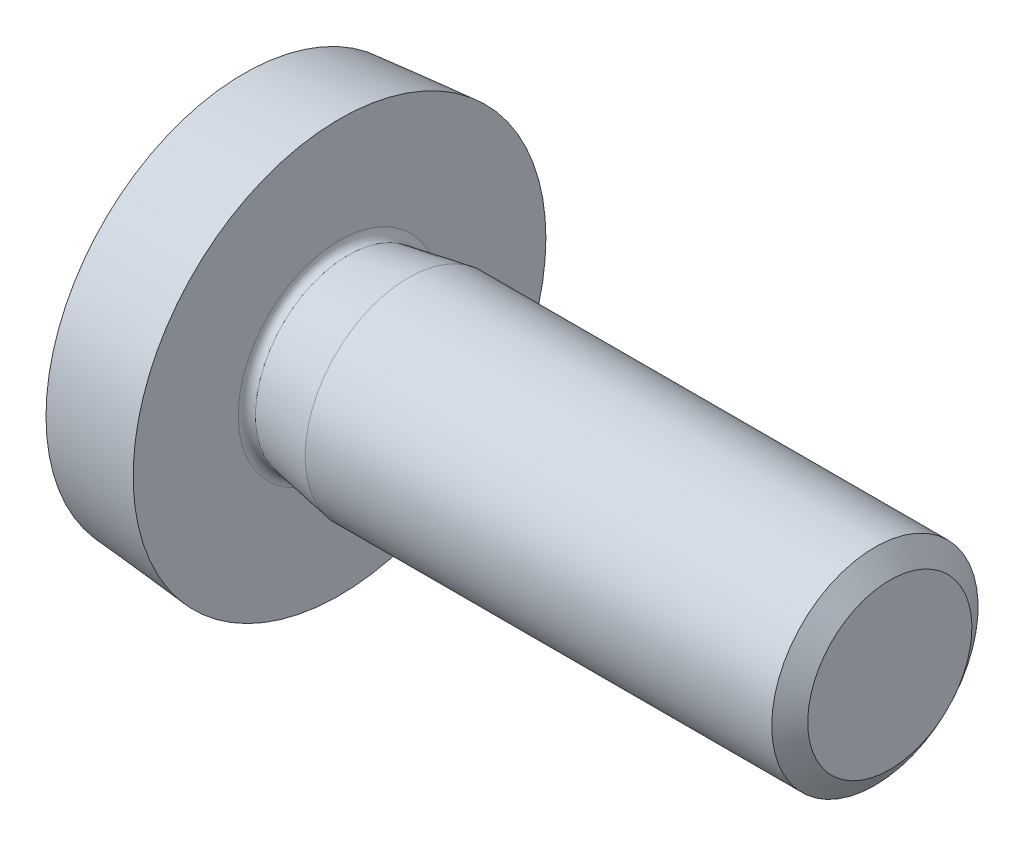
ISO-10303-21;
HEADER;
FILE_DESCRIPTION(('STEP AP214'),'2;1');
FILE_NAME('part.step','',(''),(''),'','','');
FILE_SCHEMA(('AUTOMOTIVE_DESIGN { 1 0 10303 214 1 1 1 1 }'));
ENDSEC;
DATA;
#1=APPLICATION_CONTEXT('core data for automotive mechanical design processes');
#2=APPLICATION_PROTOCOL_DEFINITION('international standard','automotive_design',2000,#1);
#3=PRODUCT_CONTEXT('',#1,'mechanical');
#4=PRODUCT('Part','Part','',(#3));
#5=PRODUCT_RELATED_PRODUCT_CATEGORY('part','',(#4));
#6=PRODUCT_DEFINITION_FORMATION('','',#4);
#7=PRODUCT_DEFINITION_CONTEXT('part definition',#1,'design');
#8=PRODUCT_DEFINITION('design','',#6,#7);
#9=PRODUCT_DEFINITION_SHAPE('','',#8);
#10=(LENGTH_UNIT() NAMED_UNIT(*) SI_UNIT(.MILLI.,.METRE.));
#11=(NAMED_UNIT(*) PLANE_ANGLE_UNIT() SI_UNIT($,.RADIAN.));
#12=(NAMED_UNIT(*) SI_UNIT($,.STERADIAN.) SOLID_ANGLE_UNIT());
#13=UNCERTAINTY_MEASURE_WITH_UNIT(LENGTH_MEASURE(1.E-05),#10,'distance_accuracy_value','');
#14=(GEOMETRIC_REPRESENTATION_CONTEXT(3) GLOBAL_UNCERTAINTY_ASSIGNED_CONTEXT((#13)) GLOBAL_UNIT_ASSIGNED_CONTEXT((#10,
#11,#12)) REPRESENTATION_CONTEXT('',''));
#15=CARTESIAN_POINT('',(0.,0.,0.));
#16=DIRECTION('',(0.,0.,1.));
#17=DIRECTION('',(1.,0.,0.));
#18=AXIS2_PLACEMENT_3D('',#15,#16,#17);
#19=CARTESIAN_POINT('',(-2.3,0.8625,3.45));
#20=DIRECTION('',(0.795355953719722,0.,0.606142645655782));
#21=DIRECTION('',(0.606142645655782,0.,-0.795355953719722));
#22=AXIS2_PLACEMENT_3D('',#19,#20,#21);
#23=PLANE('',#22);
#24=DIRECTION('',(0.,-1.,0.));
#25=VECTOR('',#24,1.);
#26=CARTESIAN_POINT('',(-2.3,0.8625,3.45));
#27=LINE('',#26,#25);
#28=CARTESIAN_POINT('',(-2.3,-0.8625,3.45));
#29=VERTEX_POINT('',#28);
#30=CARTESIAN_POINT('',(-2.3,0.8625,3.45));
#31=VERTEX_POINT('',#30);
#32=EDGE_CURVE('E139',#29,#31,#27,.F.);
#33=ORIENTED_EDGE('',*,*,#32,.T.);
#34=DIRECTION('',(0.606142645655782,0.,-0.795355953719722));
#35=VECTOR('',#34,1.);
#36=CARTESIAN_POINT('',(-2.3,0.8625,3.45));
#37=LINE('',#36,#35);
#38=CARTESIAN_POINT('',(-0.328060155582832,0.8625,0.8625));
#39=VERTEX_POINT('',#38);
#40=EDGE_CURVE('E141',#31,#39,#37,.T.);
#41=ORIENTED_EDGE('',*,*,#40,.T.);
#42=DIRECTION('',(0.,1.,0.));
#43=VECTOR('',#42,1.);
#44=CARTESIAN_POINT('',(-0.328060155582832,0.8625,0.8625));
#45=LINE('',#44,#43);
#46=CARTESIAN_POINT('',(-0.328060155582832,-0.8625,0.8625));
#47=VERTEX_POINT('',#46);
#48=EDGE_CURVE('E107',#47,#39,#45,.T.);
#49=ORIENTED_EDGE('',*,*,#48,.F.);
#50=DIRECTION('',(0.606142645655782,0.,-0.795355953719722));
#51=VECTOR('',#50,1.);
#52=CARTESIAN_POINT('',(-2.3,-0.8625,3.45));
#53=LINE('',#52,#51);
#54=EDGE_CURVE('E144',#29,#47,#53,.T.);
#55=ORIENTED_EDGE('',*,*,#54,.F.);
#56=EDGE_LOOP('',(#33,#41,#49,#55));
#57=FACE_BOUND('',#56,.T.);
#58=ADVANCED_FACE('F17',(#57),#23,.F.);
#59=CARTESIAN_POINT('',(-2.3,-3.45,0.8625));
#60=DIRECTION('',(0.792405815693061,-0.609994281330419,0.));
#61=DIRECTION('',(0.609994281330419,0.792405815693061,0.));
#62=AXIS2_PLACEMENT_3D('',#59,#60,#61);
#63=PLANE('',#62);
#64=DIRECTION('',(0.,0.,-1.));
#65=VECTOR('',#64,1.);
#66=CARTESIAN_POINT('',(-2.3,-3.45,0.8625));
#67=LINE('',#66,#65);
#68=CARTESIAN_POINT('',(-2.3,-3.45,-0.8625));
#69=VERTEX_POINT('',#68);
#70=CARTESIAN_POINT('',(-2.3,-3.45,0.8625));
#71=VERTEX_POINT('',#70);
#72=EDGE_CURVE('E130',#69,#71,#67,.F.);
#73=ORIENTED_EDGE('',*,*,#72,.T.);
#74=DIRECTION('',(0.609994281330419,0.792405815693061,0.));
#75=VECTOR('',#74,1.);
#76=CARTESIAN_POINT('',(-2.3,-3.45,0.8625));
#77=LINE('',#76,#75);
#78=CARTESIAN_POINT('',(-0.30814157129579,-0.8625,0.8625));
#79=VERTEX_POINT('',#78);
#80=EDGE_CURVE('E220',#71,#79,#77,.T.);
#81=ORIENTED_EDGE('',*,*,#80,.T.);
#82=DIRECTION('',(0.,0.,-1.));
#83=VECTOR('',#82,1.);
#84=CARTESIAN_POINT('',(-0.30814157129579,-0.8625,0.8625));
#85=LINE('',#84,#83);
#86=CARTESIAN_POINT('',(-0.30814157129579,-0.8625,-0.8625));
#87=VERTEX_POINT('',#86);
#88=EDGE_CURVE('E200',#79,#87,#85,.T.);
#89=ORIENTED_EDGE('',*,*,#88,.T.);
#90=DIRECTION('',(0.609994281330419,0.792405815693061,0.));
#91=VECTOR('',#90,1.);
#92=CARTESIAN_POINT('',(-2.3,-3.45,-0.8625));
#93=LINE('',#92,#91);
#94=EDGE_CURVE('E205',#69,#87,#93,.T.);
#95=ORIENTED_EDGE('',*,*,#94,.F.);
#96=EDGE_LOOP('',(#73,#81,#89,#95));
#97=FACE_BOUND('',#96,.T.);
#98=ADVANCED_FACE('F522',(#97),#63,.F.);
#99=CARTESIAN_POINT('',(-0.30814157129579,-0.8625,0.8625));
#100=DIRECTION('',(1.,0.,0.));
#101=DIRECTION('',(0.,0.,-1.));
#102=AXIS2_PLACEMENT_3D('',#99,#100,#101);
#103=PLANE('',#102);
#104=ORIENTED_EDGE('',*,*,#88,.F.);
#105=DIRECTION('',(0.,1.,0.));
#106=VECTOR('',#105,1.);
#107=CARTESIAN_POINT('',(-0.30814157129579,0.,0.8625));
#108=LINE('',#107,#106);
#109=CARTESIAN_POINT('',(-0.30814157129579,0.8625,0.8625));
#110=VERTEX_POINT('',#109);
#111=EDGE_CURVE('E222',#79,#110,#108,.T.);
#112=ORIENTED_EDGE('',*,*,#111,.T.);
#113=DIRECTION('',(0.,0.,1.));
#114=VECTOR('',#113,1.);
#115=CARTESIAN_POINT('',(-0.30814157129579,0.8625,0.8625));
#116=LINE('',#115,#114);
#117=CARTESIAN_POINT('',(-0.30814157129579,0.8625,-0.8625));
#118=VERTEX_POINT('',#117);
#119=EDGE_CURVE('E179',#110,#118,#116,.F.);
#120=ORIENTED_EDGE('',*,*,#119,.T.);
#121=DIRECTION('',(0.,1.,0.));
#122=VECTOR('',#121,1.);
#123=CARTESIAN_POINT('',(-0.30814157129579,0.,-0.8625));
#124=LINE('',#123,#122);
#125=EDGE_CURVE('E196',#87,#118,#124,.T.);
#126=ORIENTED_EDGE('',*,*,#125,.F.);
#127=EDGE_LOOP('',(#104,#112,#120,#126));
#128=FACE_BOUND('',#127,.T.);
#129=ADVANCED_FACE('F516',(#128),#103,.F.);
#130=CARTESIAN_POINT('',(-0.30814157129579,0.8625,0.8625));
#131=DIRECTION('',(0.792405815693061,0.609994281330419,0.));
#132=DIRECTION('',(-0.609994281330419,0.792405815693061,0.));
#133=AXIS2_PLACEMENT_3D('',#130,#131,#132);
#134=PLANE('',#133);
#135=ORIENTED_EDGE('',*,*,#119,.F.);
#136=DIRECTION('',(-0.609994281330419,0.792405815693061,0.));
#137=VECTOR('',#136,1.);
#138=CARTESIAN_POINT('',(-0.30814157129579,0.8625,0.8625));
#139=LINE('',#138,#137);
#140=CARTESIAN_POINT('',(-2.3,3.45,0.8625));
#141=VERTEX_POINT('',#140);
#142=EDGE_CURVE('E116',#110,#141,#139,.T.);
#143=ORIENTED_EDGE('',*,*,#142,.T.);
#144=DIRECTION('',(0.,0.,1.));
#145=VECTOR('',#144,1.);
#146=CARTESIAN_POINT('',(-2.3,3.45,0.8625));
#147=LINE('',#146,#145);
#148=CARTESIAN_POINT('',(-2.3,3.45,-0.8625));
#149=VERTEX_POINT('',#148);
#150=EDGE_CURVE('E155',#141,#149,#147,.F.);
#151=ORIENTED_EDGE('',*,*,#150,.T.);
#152=DIRECTION('',(-0.609994281330419,0.792405815693061,0.));
#153=VECTOR('',#152,1.);
#154=CARTESIAN_POINT('',(-0.30814157129579,0.8625,-0.8625));
#155=LINE('',#154,#153);
#156=EDGE_CURVE('E192',#118,#149,#155,.T.);
#157=ORIENTED_EDGE('',*,*,#156,.F.);
#158=EDGE_LOOP('',(#135,#143,#151,#157));
#159=FACE_BOUND('',#158,.T.);
#160=ADVANCED_FACE('F510',(#159),#134,.F.);
#161=CARTESIAN_POINT('',(-0.328060155582832,0.8625,-0.8625));
#162=DIRECTION('',(0.795355953719722,0.,-0.606142645655782));
#163=DIRECTION('',(-0.606142645655782,0.,-0.795355953719722));
#164=AXIS2_PLACEMENT_3D('',#161,#162,#163);
#165=PLANE('',#164);
#166=DIRECTION('',(0.,1.,0.));
#167=VECTOR('',#166,1.);
#168=CARTESIAN_POINT('',(-0.328060155582832,0.,-0.8625));
#169=LINE('',#168,#167);
#170=CARTESIAN_POINT('',(-0.328060155582832,0.8625,-0.8625));
#171=VERTEX_POINT('',#170);
#172=CARTESIAN_POINT('',(-0.328060155582832,-0.8625,-0.8625));
#173=VERTEX_POINT('',#172);
#174=EDGE_CURVE('E182',#171,#173,#169,.F.);
#175=ORIENTED_EDGE('',*,*,#174,.F.);
#176=DIRECTION('',(-0.606142645655782,0.,-0.795355953719722));
#177=VECTOR('',#176,1.);
#178=CARTESIAN_POINT('',(-0.328060155582832,0.8625,-0.8625));
#179=LINE('',#178,#177);
#180=CARTESIAN_POINT('',(-2.3,0.8625,-3.45));
#181=VERTEX_POINT('',#180);
#182=EDGE_CURVE('E122',#171,#181,#179,.T.);
#183=ORIENTED_EDGE('',*,*,#182,.T.);
#184=DIRECTION('',(0.,1.,0.));
#185=VECTOR('',#184,1.);
#186=CARTESIAN_POINT('',(-2.3,0.8625,-3.45));
#187=LINE('',#186,#185);
#188=CARTESIAN_POINT('',(-2.3,-0.8625,-3.45));
#189=VERTEX_POINT('',#188);
#190=EDGE_CURVE('E82',#189,#181,#187,.T.);
#191=ORIENTED_EDGE('',*,*,#190,.F.);
#192=DIRECTION('',(-0.606142645655782,0.,-0.795355953719722));
#193=VECTOR('',#192,1.);
#194=CARTESIAN_POINT('',(-0.328060155582832,-0.8625,-0.8625));
#195=LINE('',#194,#193);
#196=EDGE_CURVE('E169',#173,#189,#195,.T.);
#197=ORIENTED_EDGE('',*,*,#196,.F.);
#198=EDGE_LOOP('',(#175,#183,#191,#197));
#199=FACE_BOUND('',#198,.T.);
#200=ADVANCED_FACE('F363',(#199),#165,.F.);
#201=CARTESIAN_POINT('',(0.,0.8625,0.));
#202=DIRECTION('',(0.,1.,0.));
#203=DIRECTION('',(0.,0.,1.));
#204=AXIS2_PLACEMENT_3D('',#201,#202,#203);
#205=PLANE('',#204);
#206=CARTESIAN_POINT('',(-3.94631444741724,0.8625,-3.45));
#207=CARTESIAN_POINT('',(-3.97714311280233,0.8625,-3.36648366877087));
#208=CARTESIAN_POINT('',(-4.00685177974378,0.8625,-3.28255393845811));
#209=CARTESIAN_POINT('',(-4.06392789052948,0.8625,-3.11416785551597));
#210=CARTESIAN_POINT('',(-4.09130174348639,0.8625,-3.02971367527932));
#211=CARTESIAN_POINT('',(-4.14372647766967,0.8625,-2.8602842579847));
#212=CARTESIAN_POINT('',(-4.16878217733249,0.8625,-2.77531051182223));
#213=CARTESIAN_POINT('',(-4.21658436971985,0.8625,-2.60484612822877));
#214=CARTESIAN_POINT('',(-4.23933409137663,0.8625,-2.51935639625341));
#215=CARTESIAN_POINT('',(-4.2825331514834,0.8625,-2.34786265092894));
#216=CARTESIAN_POINT('',(-4.30298412198857,0.8625,-2.26185904868999));
#217=CARTESIAN_POINT('',(-4.34158990384638,0.8625,-2.08933802267162));
#218=CARTESIAN_POINT('',(-4.35974471519902,0.8625,-2.00282059889219));
#219=CARTESIAN_POINT('',(-4.39375746481333,0.8625,-1.82927119283388));
#220=CARTESIAN_POINT('',(-4.40961375145777,0.8625,-1.74223888686346));
#221=CARTESIAN_POINT('',(-4.43902366766466,0.8625,-1.56765878347351));
#222=CARTESIAN_POINT('',(-4.45257399034026,0.862499999999999,-1.48011042896091));
#223=CARTESIAN_POINT('',(-4.477361126086,0.862500000000001,-1.30449642581622));
#224=CARTESIAN_POINT('',(-4.48859294484434,0.862500000000005,-1.21643007223819));
#225=CARTESIAN_POINT('',(-4.50872764889703,0.862499999999995,-1.03977744971667));
#226=CARTESIAN_POINT('',(-4.5176238104541,0.862499999999983,-0.951190414370852));
#227=CARTESIAN_POINT('',(-4.52533059902794,0.862499999999952,-0.862499999999976));
#228=B_SPLINE_CURVE_WITH_KNOTS('',3,(#206,#207,#208,#209,#210,#211,#212,#213,#214,#215,#216,
#217,#218,#219,#220,#221,#222,#223,#224,#225,#226,#227),.UNSPECIFIED.,.F.,.F.,(4,2,2,2,2,2,2,2,
2,2,4),(0.,0.267065833244692,0.53337324165222,0.799114055080569,1.0644774713512,1.3296512801548,
1.5948250889584,1.86018850522903,2.12592931865738,2.39223672706491,2.6593025603096),.UNSPECIFIED.);
#229=CARTESIAN_POINT('',(-3.94631444741724,0.8625,-3.45));
#230=VERTEX_POINT('',#229);
#231=CARTESIAN_POINT('',(-4.52533059902793,0.862499999999999,-0.862500000000001));
#232=VERTEX_POINT('',#231);
#233=EDGE_CURVE('E73',#230,#232,#228,.T.);
#234=ORIENTED_EDGE('',*,*,#233,.F.);
#235=DIRECTION('',(-1.,0.,0.));
#236=VECTOR('',#235,1.);
#237=CARTESIAN_POINT('',(-2.3,0.8625,-3.45));
#238=LINE('',#237,#236);
#239=EDGE_CURVE('E171',#230,#181,#238,.F.);
#240=ORIENTED_EDGE('',*,*,#239,.T.);
#241=ORIENTED_EDGE('',*,*,#182,.F.);
#242=DIRECTION('',(1.,0.,0.));
#243=VECTOR('',#242,1.);
#244=CARTESIAN_POINT('',(0.,0.8625,-0.8625));
#245=LINE('',#244,#243);
#246=EDGE_CURVE('E186',#232,#171,#245,.T.);
#247=ORIENTED_EDGE('',*,*,#246,.F.);
#248=EDGE_LOOP('',(#234,#240,#241,#247));
#249=FACE_BOUND('',#248,.T.);
#250=ADVANCED_FACE('F357',(#249),#205,.F.);
#251=CARTESIAN_POINT('',(-2.3,3.45,0.8625));
#252=DIRECTION('',(0.,1.,0.));
#253=DIRECTION('',(0.,0.,1.));
#254=AXIS2_PLACEMENT_3D('',#251,#252,#253);
#255=PLANE('',#254);
#256=DIRECTION('',(1.,0.,0.));
#257=VECTOR('',#256,1.);
#258=CARTESIAN_POINT('',(0.,3.45,-0.8625));
#259=LINE('',#258,#257);
#260=CARTESIAN_POINT('',(-3.94631444741724,3.45,-0.8625));
#261=VERTEX_POINT('',#260);
#262=EDGE_CURVE('E195',#149,#261,#259,.F.);
#263=ORIENTED_EDGE('',*,*,#262,.F.);
#264=ORIENTED_EDGE('',*,*,#150,.F.);
#265=DIRECTION('',(1.,0.,0.));
#266=VECTOR('',#265,1.);
#267=CARTESIAN_POINT('',(0.,3.45,0.8625));
#268=LINE('',#267,#266);
#269=CARTESIAN_POINT('',(-3.94631444741724,3.45,0.8625));
#270=VERTEX_POINT('',#269);
#271=EDGE_CURVE('E231',#141,#270,#268,.F.);
#272=ORIENTED_EDGE('',*,*,#271,.T.);
#273=CARTESIAN_POINT('',(-3.94631444741724,3.45,-0.862499999999999));
#274=CARTESIAN_POINT('',(-3.95294091135976,3.45,-0.790695326163588));
#275=CARTESIAN_POINT('',(-3.95873958698046,3.45,-0.718814271789546));
#276=CARTESIAN_POINT('',(-3.96867110087433,3.45,-0.57505161932912));
#277=CARTESIAN_POINT('',(-3.97280656416535,3.45,-0.50317020257961));
#278=CARTESIAN_POINT('',(-3.97941890948352,3.45,-0.359407208954427));
#279=CARTESIAN_POINT('',(-3.98189753871711,3.45,-0.28752571243822));
#280=CARTESIAN_POINT('',(-3.98520107089638,3.45,-0.14376279721681));
#281=CARTESIAN_POINT('',(-3.98602684846002,3.45,-0.0718813986084052));
#282=CARTESIAN_POINT('',(-3.98602684846002,3.45,0.0718813986084039));
#283=CARTESIAN_POINT('',(-3.98520107089638,3.45,0.143762797216808));
#284=CARTESIAN_POINT('',(-3.98189753871711,3.45,0.287525712438218));
#285=CARTESIAN_POINT('',(-3.97941890948352,3.45,0.359407208954426));
#286=CARTESIAN_POINT('',(-3.97280656416535,3.45,0.503170202579609));
#287=CARTESIAN_POINT('',(-3.96867110087433,3.45,0.575051619329119));
#288=CARTESIAN_POINT('',(-3.95873958698046,3.45,0.718814271789545));
#289=CARTESIAN_POINT('',(-3.95294091135976,3.45,0.790695326163587));
#290=CARTESIAN_POINT('',(-3.94631444741724,3.45,0.862499999999998));
#291=B_SPLINE_CURVE_WITH_KNOTS('',3,(#273,#274,#275,#276,#277,#278,#279,#280,#281,#282,#283,
#284,#285,#286,#287,#288,#289,#290),.UNSPECIFIED.,.F.,.F.,(4,2,2,2,2,2,2,2,4),(0.,
0.216324549400109,0.432306325072924,0.64805997735649,0.863699431879933,1.07933888640338,
1.29509253868694,1.51107431435976,1.72739886375987),.UNSPECIFIED.);
#292=EDGE_CURVE('E327',#261,#270,#291,.T.);
#293=ORIENTED_EDGE('',*,*,#292,.F.);
#294=EDGE_LOOP('',(#263,#264,#272,#293));
#295=FACE_BOUND('',#294,.T.);
#296=ADVANCED_FACE('F325',(#295),#255,.F.);
#297=CARTESIAN_POINT('',(0.,0.8625,0.));
#298=DIRECTION('',(0.,1.,0.));
#299=DIRECTION('',(0.,0.,1.));
#300=AXIS2_PLACEMENT_3D('',#297,#298,#299);
#301=PLANE('',#300);
#302=ORIENTED_EDGE('',*,*,#40,.F.);
#303=DIRECTION('',(1.,0.,0.));
#304=VECTOR('',#303,1.);
#305=CARTESIAN_POINT('',(-4.83,0.8625,3.45));
#306=LINE('',#305,#304);
#307=CARTESIAN_POINT('',(-3.94631444741724,0.862500000000001,3.45));
#308=VERTEX_POINT('',#307);
#309=EDGE_CURVE('E148',#31,#308,#306,.F.);
#310=ORIENTED_EDGE('',*,*,#309,.T.);
#311=CARTESIAN_POINT('',(-4.52533059902793,0.8625,0.8625));
#312=CARTESIAN_POINT('',(-4.5176238104541,0.8625,0.951190414370874));
#313=CARTESIAN_POINT('',(-4.50872764889702,0.8625,1.03977744971669));
#314=CARTESIAN_POINT('',(-4.48859294484434,0.8625,1.21643007223821));
#315=CARTESIAN_POINT('',(-4.477361126086,0.8625,1.30449642581623));
#316=CARTESIAN_POINT('',(-4.45257399034026,0.8625,1.48011042896092));
#317=CARTESIAN_POINT('',(-4.43902366766466,0.8625,1.56765878347352));
#318=CARTESIAN_POINT('',(-4.40961375145777,0.8625,1.74223888686345));
#319=CARTESIAN_POINT('',(-4.39375746481333,0.8625,1.82927119283387));
#320=CARTESIAN_POINT('',(-4.35974471519902,0.8625,2.00282059889218));
#321=CARTESIAN_POINT('',(-4.34158990384638,0.8625,2.08933802267161));
#322=CARTESIAN_POINT('',(-4.30298412198857,0.8625,2.26185904868998));
#323=CARTESIAN_POINT('',(-4.2825331514834,0.8625,2.34786265092892));
#324=CARTESIAN_POINT('',(-4.23933409137664,0.8625,2.51935639625338));
#325=CARTESIAN_POINT('',(-4.21658436971986,0.8625,2.60484612822874));
#326=CARTESIAN_POINT('',(-4.1687821773325,0.8625,2.7753105118222));
#327=CARTESIAN_POINT('',(-4.14372647766969,0.8625,2.86028425798467));
#328=CARTESIAN_POINT('',(-4.0913017434864,0.8625,3.02971367527928));
#329=CARTESIAN_POINT('',(-4.0639278905295,0.8625,3.11416785551593));
#330=CARTESIAN_POINT('',(-4.0068517797438,0.8625,3.28255393845807));
#331=CARTESIAN_POINT('',(-3.97714311280234,0.8625,3.36648366877082));
#332=CARTESIAN_POINT('',(-3.94631444741726,0.8625,3.44999999999995));
#333=B_SPLINE_CURVE_WITH_KNOTS('',3,(#311,#312,#313,#314,#315,#316,#317,#318,#319,#320,#321,
#322,#323,#324,#325,#326,#327,#328,#329,#330,#331,#332),.UNSPECIFIED.,.F.,.F.,(4,2,2,2,2,2,2,2,
2,2,4),(0.,0.267065833244684,0.533373241652204,0.799114055080544,1.06447747135116,
1.32965128015476,1.59482508895836,1.86018850522897,2.12592931865731,2.39223672706484,
2.65930256030952),.UNSPECIFIED.);
#334=CARTESIAN_POINT('',(-4.52533059902793,0.8625,0.8625));
#335=VERTEX_POINT('',#334);
#336=EDGE_CURVE('E333',#335,#308,#333,.T.);
#337=ORIENTED_EDGE('',*,*,#336,.F.);
#338=DIRECTION('',(1.,0.,0.));
#339=VECTOR('',#338,1.);
#340=CARTESIAN_POINT('',(0.,0.8625,0.8625));
#341=LINE('',#340,#339);
#342=EDGE_CURVE('E154',#335,#39,#341,.T.);
#343=ORIENTED_EDGE('',*,*,#342,.T.);
#344=EDGE_LOOP('',(#302,#310,#337,#343));
#345=FACE_BOUND('',#344,.T.);
#346=ADVANCED_FACE('F151',(#345),#301,.F.);
#347=CARTESIAN_POINT('',(-4.83,0.8625,3.45));
#348=DIRECTION('',(0.,0.,1.));
#349=DIRECTION('',(0.,-1.,0.));
#350=AXIS2_PLACEMENT_3D('',#347,#348,#349);
#351=PLANE('',#350);
#352=ORIENTED_EDGE('',*,*,#309,.F.);
#353=ORIENTED_EDGE('',*,*,#32,.F.);
#354=DIRECTION('',(1.,0.,0.));
#355=VECTOR('',#354,1.);
#356=CARTESIAN_POINT('',(0.,-0.8625,3.45));
#357=LINE('',#356,#355);
#358=CARTESIAN_POINT('',(-3.94631444741724,-0.862499999999999,3.45));
#359=VERTEX_POINT('',#358);
#360=EDGE_CURVE('E161',#359,#29,#357,.T.);
#361=ORIENTED_EDGE('',*,*,#360,.F.);
#362=CARTESIAN_POINT('',(-3.94631444741724,0.862500000000002,3.45));
#363=CARTESIAN_POINT('',(-3.95294091135976,0.790695326163591,3.45));
#364=CARTESIAN_POINT('',(-3.95873958698046,0.718814271789549,3.45));
#365=CARTESIAN_POINT('',(-3.96867110087433,0.575051619329122,3.45));
#366=CARTESIAN_POINT('',(-3.97280656416535,0.503170202579612,3.45));
#367=CARTESIAN_POINT('',(-3.97941890948352,0.359407208954429,3.45));
#368=CARTESIAN_POINT('',(-3.98189753871711,0.287525712438222,3.45));
#369=CARTESIAN_POINT('',(-3.98520107089638,0.143762797216812,3.45));
#370=CARTESIAN_POINT('',(-3.98602684846002,0.0718813986084069,3.45));
#371=CARTESIAN_POINT('',(-3.98602684846002,-0.0718813986084025,3.45));
#372=CARTESIAN_POINT('',(-3.98520107089638,-0.143762797216807,3.45));
#373=CARTESIAN_POINT('',(-3.98189753871711,-0.287525712438217,3.45));
#374=CARTESIAN_POINT('',(-3.97941890948352,-0.359407208954425,3.45));
#375=CARTESIAN_POINT('',(-3.97280656416535,-0.503170202579608,3.45));
#376=CARTESIAN_POINT('',(-3.96867110087433,-0.575051619329118,3.45));
#377=CARTESIAN_POINT('',(-3.95873958698046,-0.718814271789545,3.45));
#378=CARTESIAN_POINT('',(-3.95294091135976,-0.790695326163587,3.45));
#379=CARTESIAN_POINT('',(-3.94631444741724,-0.862499999999998,3.45));
#380=B_SPLINE_CURVE_WITH_KNOTS('',3,(#362,#363,#364,#365,#366,#367,#368,#369,#370,#371,#372,
#373,#374,#375,#376,#377,#378,#379),.UNSPECIFIED.,.F.,.F.,(4,2,2,2,2,2,2,2,4),(0.,
0.21632454940011,0.432306325072925,0.648059977356491,0.863699431879935,1.07933888640338,
1.29509253868694,1.51107431435976,1.72739886375987),.UNSPECIFIED.);
#381=EDGE_CURVE('E159',#308,#359,#380,.T.);
#382=ORIENTED_EDGE('',*,*,#381,.F.);
#383=EDGE_LOOP('',(#352,#353,#361,#382));
#384=FACE_BOUND('',#383,.T.);
#385=ADVANCED_FACE('F157',(#384),#351,.F.);
#386=CARTESIAN_POINT('',(0.,-0.8625,0.));
#387=DIRECTION('',(0.,1.,0.));
#388=DIRECTION('',(0.,0.,1.));
#389=AXIS2_PLACEMENT_3D('',#386,#387,#388);
#390=PLANE('',#389);
#391=ORIENTED_EDGE('',*,*,#360,.T.);
#392=ORIENTED_EDGE('',*,*,#54,.T.);
#393=DIRECTION('',(1.,0.,0.));
#394=VECTOR('',#393,1.);
#395=CARTESIAN_POINT('',(0.,-0.8625,0.8625));
#396=LINE('',#395,#394);
#397=CARTESIAN_POINT('',(-4.52533059902793,-0.862499999999999,0.8625));
#398=VERTEX_POINT('',#397);
#399=EDGE_CURVE('E217',#47,#398,#396,.F.);
#400=ORIENTED_EDGE('',*,*,#399,.T.);
#401=CARTESIAN_POINT('',(-3.94631444741724,-0.862499999999998,3.45));
#402=CARTESIAN_POINT('',(-3.97714311280233,-0.862499999999999,3.36648366877087));
#403=CARTESIAN_POINT('',(-4.00685177974378,-0.8625,3.28255393845811));
#404=CARTESIAN_POINT('',(-4.06392789052948,-0.8625,3.11416785551597));
#405=CARTESIAN_POINT('',(-4.09130174348639,-0.8625,3.02971367527932));
#406=CARTESIAN_POINT('',(-4.14372647766967,-0.8625,2.86028425798471));
#407=CARTESIAN_POINT('',(-4.16878217733249,-0.8625,2.77531051182224));
#408=CARTESIAN_POINT('',(-4.21658436971985,-0.8625,2.60484612822877));
#409=CARTESIAN_POINT('',(-4.23933409137663,-0.8625,2.51935639625341));
#410=CARTESIAN_POINT('',(-4.2825331514834,-0.8625,2.34786265092895));
#411=CARTESIAN_POINT('',(-4.30298412198857,-0.8625,2.26185904869001));
#412=CARTESIAN_POINT('',(-4.34158990384638,-0.8625,2.08933802267163));
#413=CARTESIAN_POINT('',(-4.35974471519902,-0.8625,2.00282059889221));
#414=CARTESIAN_POINT('',(-4.39375746481333,-0.8625,1.82927119283389));
#415=CARTESIAN_POINT('',(-4.40961375145777,-0.8625,1.74223888686347));
#416=CARTESIAN_POINT('',(-4.43902366766465,-0.8625,1.56765878347353));
#417=CARTESIAN_POINT('',(-4.45257399034026,-0.8625,1.48011042896093));
#418=CARTESIAN_POINT('',(-4.477361126086,-0.8625,1.30449642581624));
#419=CARTESIAN_POINT('',(-4.48859294484434,-0.8625,1.21643007223821));
#420=CARTESIAN_POINT('',(-4.50872764889702,-0.8625,1.03977744971669));
#421=CARTESIAN_POINT('',(-4.5176238104541,-0.8625,0.951190414370876));
#422=CARTESIAN_POINT('',(-4.52533059902793,-0.862500000000001,0.8625));
#423=B_SPLINE_CURVE_WITH_KNOTS('',3,(#401,#402,#403,#404,#405,#406,#407,#408,#409,#410,#411,
#412,#413,#414,#415,#416,#417,#418,#419,#420,#421,#422),.UNSPECIFIED.,.F.,.F.,(4,2,2,2,2,2,2,2,
2,2,4),(0.,0.267065833244689,0.533373241652215,0.799114055080561,1.06447747135119,
1.32965128015479,1.59482508895839,1.86018850522901,2.12592931865736,2.39223672706489,
2.65930256030957),.UNSPECIFIED.);
#424=EDGE_CURVE('E641',#359,#398,#423,.T.);
#425=ORIENTED_EDGE('',*,*,#424,.F.);
#426=EDGE_LOOP('',(#391,#392,#400,#425));
#427=FACE_BOUND('',#426,.T.);
#428=ADVANCED_FACE('F479',(#427),#390,.T.);
#429=CARTESIAN_POINT('',(0.,0.,0.8625));
#430=DIRECTION('',(0.,0.,1.));
#431=DIRECTION('',(1.,0.,0.));
#432=AXIS2_PLACEMENT_3D('',#429,#430,#431);
#433=PLANE('',#432);
#434=ORIENTED_EDGE('',*,*,#48,.T.);
#435=ORIENTED_EDGE('',*,*,#342,.F.);
#436=CARTESIAN_POINT('',(-3.94631444741724,3.45,0.8625));
#437=CARTESIAN_POINT('',(-3.97714311280233,3.36648366877087,0.8625));
#438=CARTESIAN_POINT('',(-4.00685177974378,3.28255393845811,0.8625));
#439=CARTESIAN_POINT('',(-4.06392789052948,3.11416785551597,0.8625));
#440=CARTESIAN_POINT('',(-4.09130174348639,3.02971367527932,0.8625));
#441=CARTESIAN_POINT('',(-4.14372647766967,2.86028425798471,0.8625));
#442=CARTESIAN_POINT('',(-4.16878217733249,2.77531051182224,0.8625));
#443=CARTESIAN_POINT('',(-4.21658436971985,2.60484612822877,0.8625));
#444=CARTESIAN_POINT('',(-4.23933409137663,2.51935639625341,0.8625));
#445=CARTESIAN_POINT('',(-4.2825331514834,2.34786265092895,0.8625));
#446=CARTESIAN_POINT('',(-4.30298412198857,2.26185904869,0.8625));
#447=CARTESIAN_POINT('',(-4.34158990384638,2.08933802267163,0.8625));
#448=CARTESIAN_POINT('',(-4.35974471519902,2.00282059889221,0.8625));
#449=CARTESIAN_POINT('',(-4.39375746481333,1.82927119283389,0.8625));
#450=CARTESIAN_POINT('',(-4.40961375145777,1.74223888686347,0.8625));
#451=CARTESIAN_POINT('',(-4.43902366766465,1.56765878347353,0.8625));
#452=CARTESIAN_POINT('',(-4.45257399034026,1.48011042896093,0.8625));
#453=CARTESIAN_POINT('',(-4.477361126086,1.30449642581624,0.8625));
#454=CARTESIAN_POINT('',(-4.48859294484434,1.21643007223821,0.8625));
#455=CARTESIAN_POINT('',(-4.50872764889702,1.03977744971669,0.8625));
#456=CARTESIAN_POINT('',(-4.51762381045409,0.951190414370876,0.8625));
#457=CARTESIAN_POINT('',(-4.52533059902793,0.8625,0.8625));
#458=B_SPLINE_CURVE_WITH_KNOTS('',3,(#436,#437,#438,#439,#440,#441,#442,#443,#444,#445,#446,
#447,#448,#449,#450,#451,#452,#453,#454,#455,#456,#457),.UNSPECIFIED.,.F.,.F.,(4,2,2,2,2,2,2,2,
2,2,4),(0.,0.267065833244688,0.533373241652214,0.799114055080561,1.06447747135119,
1.32965128015479,1.59482508895839,1.86018850522901,2.12592931865736,2.39223672706489,
2.65930256030957),.UNSPECIFIED.);
#459=EDGE_CURVE('E330',#270,#335,#458,.T.);
#460=ORIENTED_EDGE('',*,*,#459,.F.);
#461=ORIENTED_EDGE('',*,*,#271,.F.);
#462=ORIENTED_EDGE('',*,*,#142,.F.);
#463=ORIENTED_EDGE('',*,*,#111,.F.);
#464=ORIENTED_EDGE('',*,*,#80,.F.);
#465=DIRECTION('',(1.,0.,0.));
#466=VECTOR('',#465,1.);
#467=CARTESIAN_POINT('',(-5.06,-3.45,0.8625));
#468=LINE('',#467,#466);
#469=CARTESIAN_POINT('',(-3.94631444741724,-3.45,0.8625));
#470=VERTEX_POINT('',#469);
#471=EDGE_CURVE('E216',#71,#470,#468,.F.);
#472=ORIENTED_EDGE('',*,*,#471,.T.);
#473=CARTESIAN_POINT('',(-4.52533059902793,-0.862499999999999,0.8625));
#474=CARTESIAN_POINT('',(-4.51762381045409,-0.951190414370874,0.8625));
#475=CARTESIAN_POINT('',(-4.50872764889702,-1.03977744971669,0.8625));
#476=CARTESIAN_POINT('',(-4.48859294484434,-1.21643007223821,0.8625));
#477=CARTESIAN_POINT('',(-4.477361126086,-1.30449642581624,0.8625));
#478=CARTESIAN_POINT('',(-4.45257399034026,-1.48011042896093,0.8625));
#479=CARTESIAN_POINT('',(-4.43902366766465,-1.56765878347353,0.8625));
#480=CARTESIAN_POINT('',(-4.40961375145777,-1.74223888686347,0.8625));
#481=CARTESIAN_POINT('',(-4.39375746481333,-1.82927119283389,0.8625));
#482=CARTESIAN_POINT('',(-4.35974471519902,-2.0028205988922,0.8625));
#483=CARTESIAN_POINT('',(-4.34158990384638,-2.08933802267163,0.8625));
#484=CARTESIAN_POINT('',(-4.30298412198857,-2.26185904869,0.8625));
#485=CARTESIAN_POINT('',(-4.2825331514834,-2.34786265092895,0.8625));
#486=CARTESIAN_POINT('',(-4.23933409137663,-2.51935639625341,0.8625));
#487=CARTESIAN_POINT('',(-4.21658436971985,-2.60484612822877,0.8625));
#488=CARTESIAN_POINT('',(-4.16878217733249,-2.77531051182224,0.8625));
#489=CARTESIAN_POINT('',(-4.14372647766968,-2.8602842579847,0.8625));
#490=CARTESIAN_POINT('',(-4.09130174348639,-3.02971367527932,0.8625));
#491=CARTESIAN_POINT('',(-4.06392789052948,-3.11416785551597,0.862500000000001));
#492=CARTESIAN_POINT('',(-4.00685177974379,-3.28255393845811,0.8625));
#493=CARTESIAN_POINT('',(-3.97714311280233,-3.36648366877087,0.862499999999998));
#494=CARTESIAN_POINT('',(-3.94631444741724,-3.45,0.862499999999995));
#495=B_SPLINE_CURVE_WITH_KNOTS('',3,(#473,#474,#475,#476,#477,#478,#479,#480,#481,#482,#483,
#484,#485,#486,#487,#488,#489,#490,#491,#492,#493,#494),.UNSPECIFIED.,.F.,.F.,(4,2,2,2,2,2,2,2,
2,2,4),(0.,0.267065833244688,0.533373241652214,0.79911405508056,1.06447747135118,
1.32965128015479,1.59482508895839,1.86018850522901,2.12592931865736,2.39223672706488,
2.65930256030957),.UNSPECIFIED.);
#496=EDGE_CURVE('E637',#398,#470,#495,.T.);
#497=ORIENTED_EDGE('',*,*,#496,.F.);
#498=ORIENTED_EDGE('',*,*,#399,.F.);
#499=EDGE_LOOP('',(#434,#435,#460,#461,#462,#463,#464,#472,#497,#498));
#500=FACE_BOUND('',#499,.T.);
#501=ADVANCED_FACE('F331',(#500),#433,.F.);
#502=CARTESIAN_POINT('',(-5.06,-3.45,0.8625));
#503=DIRECTION('',(0.,-1.,0.));
#504=DIRECTION('',(0.,0.,-1.));
#505=AXIS2_PLACEMENT_3D('',#502,#503,#504);
#506=PLANE('',#505);
#507=ORIENTED_EDGE('',*,*,#471,.F.);
#508=ORIENTED_EDGE('',*,*,#72,.F.);
#509=DIRECTION('',(1.,0.,0.));
#510=VECTOR('',#509,1.);
#511=CARTESIAN_POINT('',(0.,-3.45,-0.8625));
#512=LINE('',#511,#510);
#513=CARTESIAN_POINT('',(-3.94631444741724,-3.45,-0.8625));
#514=VERTEX_POINT('',#513);
#515=EDGE_CURVE('E185',#514,#69,#512,.T.);
#516=ORIENTED_EDGE('',*,*,#515,.F.);
#517=CARTESIAN_POINT('',(-3.94631444741724,-3.45,0.8625));
#518=CARTESIAN_POINT('',(-3.95294091135976,-3.45,0.790695326163589));
#519=CARTESIAN_POINT('',(-3.95873958698046,-3.45,0.718814271789547));
#520=CARTESIAN_POINT('',(-3.96867110087433,-3.45,0.57505161932912));
#521=CARTESIAN_POINT('',(-3.97280656416535,-3.45,0.50317020257961));
#522=CARTESIAN_POINT('',(-3.97941890948352,-3.45,0.359407208954427));
#523=CARTESIAN_POINT('',(-3.98189753871711,-3.45,0.287525712438219));
#524=CARTESIAN_POINT('',(-3.98520107089638,-3.45,0.143762797216809));
#525=CARTESIAN_POINT('',(-3.98602684846002,-3.45,0.0718813986084046));
#526=CARTESIAN_POINT('',(-3.98602684846002,-3.45,-0.0718813986084048));
#527=CARTESIAN_POINT('',(-3.98520107089638,-3.45,-0.143762797216809));
#528=CARTESIAN_POINT('',(-3.98189753871711,-3.45,-0.28752571243822));
#529=CARTESIAN_POINT('',(-3.97941890948352,-3.45,-0.359407208954427));
#530=CARTESIAN_POINT('',(-3.97280656416535,-3.45,-0.50317020257961));
#531=CARTESIAN_POINT('',(-3.96867110087433,-3.45,-0.57505161932912));
#532=CARTESIAN_POINT('',(-3.95873958698046,-3.45,-0.718814271789547));
#533=CARTESIAN_POINT('',(-3.95294091135976,-3.45,-0.790695326163589));
#534=CARTESIAN_POINT('',(-3.94631444741724,-3.45,-0.8625));
#535=B_SPLINE_CURVE_WITH_KNOTS('',3,(#517,#518,#519,#520,#521,#522,#523,#524,#525,#526,#527,
#528,#529,#530,#531,#532,#533,#534),.UNSPECIFIED.,.F.,.F.,(4,2,2,2,2,2,2,2,4),(0.,
0.21632454940011,0.432306325072925,0.648059977356491,0.863699431879935,1.07933888640338,
1.29509253868694,1.51107431435976,1.72739886375987),.UNSPECIFIED.);
#536=EDGE_CURVE('E632',#470,#514,#535,.T.);
#537=ORIENTED_EDGE('',*,*,#536,.F.);
#538=EDGE_LOOP('',(#507,#508,#516,#537));
#539=FACE_BOUND('',#538,.T.);
#540=ADVANCED_FACE('F465',(#539),#506,.F.);
#541=CARTESIAN_POINT('',(0.,0.,-0.8625));
#542=DIRECTION('',(0.,0.,1.));
#543=DIRECTION('',(1.,0.,0.));
#544=AXIS2_PLACEMENT_3D('',#541,#542,#543);
#545=PLANE('',#544);
#546=ORIENTED_EDGE('',*,*,#262,.T.);
#547=CARTESIAN_POINT('',(-4.52533059902793,0.862499999999998,-0.862500000000003));
#548=CARTESIAN_POINT('',(-4.5176238104541,0.951190414370874,-0.862500000000001));
#549=CARTESIAN_POINT('',(-4.50872764889702,1.03977744971669,-0.8625));
#550=CARTESIAN_POINT('',(-4.48859294484434,1.21643007223821,-0.8625));
#551=CARTESIAN_POINT('',(-4.477361126086,1.30449642581624,-0.8625));
#552=CARTESIAN_POINT('',(-4.45257399034026,1.48011042896093,-0.8625));
#553=CARTESIAN_POINT('',(-4.43902366766465,1.56765878347353,-0.8625));
#554=CARTESIAN_POINT('',(-4.40961375145777,1.74223888686347,-0.8625));
#555=CARTESIAN_POINT('',(-4.39375746481333,1.82927119283389,-0.8625));
#556=CARTESIAN_POINT('',(-4.35974471519902,2.0028205988922,-0.8625));
#557=CARTESIAN_POINT('',(-4.34158990384638,2.08933802267163,-0.8625));
#558=CARTESIAN_POINT('',(-4.30298412198857,2.26185904869,-0.8625));
#559=CARTESIAN_POINT('',(-4.2825331514834,2.34786265092895,-0.8625));
#560=CARTESIAN_POINT('',(-4.23933409137663,2.51935639625341,-0.8625));
#561=CARTESIAN_POINT('',(-4.21658436971985,2.60484612822877,-0.8625));
#562=CARTESIAN_POINT('',(-4.16878217733249,2.77531051182224,-0.8625));
#563=CARTESIAN_POINT('',(-4.14372647766967,2.8602842579847,-0.8625));
#564=CARTESIAN_POINT('',(-4.09130174348639,3.02971367527932,-0.8625));
#565=CARTESIAN_POINT('',(-4.06392789052948,3.11416785551597,-0.8625));
#566=CARTESIAN_POINT('',(-4.00685177974378,3.28255393845811,-0.8625));
#567=CARTESIAN_POINT('',(-3.97714311280233,3.36648366877087,-0.8625));
#568=CARTESIAN_POINT('',(-3.94631444741724,3.45,-0.862499999999999));
#569=B_SPLINE_CURVE_WITH_KNOTS('',3,(#547,#548,#549,#550,#551,#552,#553,#554,#555,#556,#557,
#558,#559,#560,#561,#562,#563,#564,#565,#566,#567,#568),.UNSPECIFIED.,.F.,.F.,(4,2,2,2,2,2,2,2,
2,2,4),(0.,0.267065833244689,0.533373241652215,0.799114055080561,1.06447747135119,
1.32965128015479,1.59482508895839,1.86018850522901,2.12592931865736,2.39223672706489,
2.65930256030957),.UNSPECIFIED.);
#570=EDGE_CURVE('E337',#232,#261,#569,.T.);
#571=ORIENTED_EDGE('',*,*,#570,.F.);
#572=ORIENTED_EDGE('',*,*,#246,.T.);
#573=ORIENTED_EDGE('',*,*,#174,.T.);
#574=DIRECTION('',(1.,0.,0.));
#575=VECTOR('',#574,1.);
#576=CARTESIAN_POINT('',(0.,-0.8625,-0.8625));
#577=LINE('',#576,#575);
#578=CARTESIAN_POINT('',(-4.52533059902793,-0.8625,-0.862500000000001));
#579=VERTEX_POINT('',#578);
#580=EDGE_CURVE('E172',#579,#173,#577,.T.);
#581=ORIENTED_EDGE('',*,*,#580,.F.);
#582=CARTESIAN_POINT('',(-3.94631444741724,-3.45,-0.8625));
#583=CARTESIAN_POINT('',(-3.97714311280233,-3.36648366877087,-0.8625));
#584=CARTESIAN_POINT('',(-4.00685177974378,-3.28255393845811,-0.8625));
#585=CARTESIAN_POINT('',(-4.06392789052948,-3.11416785551597,-0.8625));
#586=CARTESIAN_POINT('',(-4.09130174348639,-3.02971367527932,-0.8625));
#587=CARTESIAN_POINT('',(-4.14372647766967,-2.86028425798471,-0.8625));
#588=CARTESIAN_POINT('',(-4.16878217733249,-2.77531051182224,-0.8625));
#589=CARTESIAN_POINT('',(-4.21658436971985,-2.60484612822878,-0.8625));
#590=CARTESIAN_POINT('',(-4.23933409137663,-2.51935639625342,-0.8625));
#591=CARTESIAN_POINT('',(-4.28253315148339,-2.34786265092896,-0.8625));
#592=CARTESIAN_POINT('',(-4.30298412198856,-2.26185904869001,-0.8625));
#593=CARTESIAN_POINT('',(-4.34158990384638,-2.08933802267164,-0.8625));
#594=CARTESIAN_POINT('',(-4.35974471519902,-2.00282059889221,-0.8625));
#595=CARTESIAN_POINT('',(-4.39375746481333,-1.8292711928339,-0.8625));
#596=CARTESIAN_POINT('',(-4.40961375145777,-1.74223888686348,-0.8625));
#597=CARTESIAN_POINT('',(-4.43902366766465,-1.56765878347354,-0.8625));
#598=CARTESIAN_POINT('',(-4.45257399034026,-1.48011042896094,-0.8625));
#599=CARTESIAN_POINT('',(-4.477361126086,-1.30449642581625,-0.8625));
#600=CARTESIAN_POINT('',(-4.48859294484434,-1.21643007223822,-0.862499999999999));
#601=CARTESIAN_POINT('',(-4.50872764889702,-1.0397774497167,-0.862500000000001));
#602=CARTESIAN_POINT('',(-4.51762381045409,-0.951190414370888,-0.862500000000003));
#603=CARTESIAN_POINT('',(-4.52533059902793,-0.862500000000012,-0.862500000000008));
#604=B_SPLINE_CURVE_WITH_KNOTS('',3,(#582,#583,#584,#585,#586,#587,#588,#589,#590,#591,#592,
#593,#594,#595,#596,#597,#598,#599,#600,#601,#602,#603),.UNSPECIFIED.,.F.,.F.,(4,2,2,2,2,2,2,2,
2,2,4),(0.,0.267065833244687,0.533373241652212,0.799114055080556,1.06447747135118,
1.32965128015478,1.59482508895838,1.860188505229,2.12592931865735,2.39223672706487,
2.65930256030956),.UNSPECIFIED.);
#605=EDGE_CURVE('E636',#514,#579,#604,.T.);
#606=ORIENTED_EDGE('',*,*,#605,.F.);
#607=ORIENTED_EDGE('',*,*,#515,.T.);
#608=ORIENTED_EDGE('',*,*,#94,.T.);
#609=ORIENTED_EDGE('',*,*,#125,.T.);
#610=ORIENTED_EDGE('',*,*,#156,.T.);
#611=EDGE_LOOP('',(#546,#571,#572,#573,#581,#606,#607,#608,#609,#610));
#612=FACE_BOUND('',#611,.T.);
#613=ADVANCED_FACE('F459',(#612),#545,.T.);
#614=CARTESIAN_POINT('',(0.,-0.8625,0.));
#615=DIRECTION('',(0.,1.,0.));
#616=DIRECTION('',(0.,0.,1.));
#617=AXIS2_PLACEMENT_3D('',#614,#615,#616);
#618=PLANE('',#617);
#619=DIRECTION('',(-1.,0.,0.));
#620=VECTOR('',#619,1.);
#621=CARTESIAN_POINT('',(-2.3,-0.8625,-3.45));
#622=LINE('',#621,#620);
#623=CARTESIAN_POINT('',(-3.94631444741724,-0.862500000000001,-3.45));
#624=VERTEX_POINT('',#623);
#625=EDGE_CURVE('E35',#189,#624,#622,.T.);
#626=ORIENTED_EDGE('',*,*,#625,.T.);
#627=CARTESIAN_POINT('',(-4.52533059902793,-0.862499999999999,-0.862500000000003));
#628=CARTESIAN_POINT('',(-4.5176238104541,-0.8625,-0.951190414370879));
#629=CARTESIAN_POINT('',(-4.50872764889702,-0.8625,-1.0397774497167));
#630=CARTESIAN_POINT('',(-4.48859294484434,-0.8625,-1.21643007223822));
#631=CARTESIAN_POINT('',(-4.477361126086,-0.8625,-1.30449642581625));
#632=CARTESIAN_POINT('',(-4.45257399034026,-0.8625,-1.48011042896094));
#633=CARTESIAN_POINT('',(-4.43902366766465,-0.8625,-1.56765878347353));
#634=CARTESIAN_POINT('',(-4.40961375145777,-0.8625,-1.74223888686348));
#635=CARTESIAN_POINT('',(-4.39375746481333,-0.8625,-1.8292711928339));
#636=CARTESIAN_POINT('',(-4.35974471519902,-0.8625,-2.00282059889221));
#637=CARTESIAN_POINT('',(-4.34158990384638,-0.8625,-2.08933802267164));
#638=CARTESIAN_POINT('',(-4.30298412198856,-0.8625,-2.26185904869001));
#639=CARTESIAN_POINT('',(-4.28253315148339,-0.8625,-2.34786265092896));
#640=CARTESIAN_POINT('',(-4.23933409137663,-0.8625,-2.51935639625342));
#641=CARTESIAN_POINT('',(-4.21658436971985,-0.8625,-2.60484612822878));
#642=CARTESIAN_POINT('',(-4.16878217733249,-0.8625,-2.77531051182225));
#643=CARTESIAN_POINT('',(-4.14372647766967,-0.862500000000001,-2.86028425798471));
#644=CARTESIAN_POINT('',(-4.09130174348639,-0.862499999999999,-3.02971367527933));
#645=CARTESIAN_POINT('',(-4.06392789052948,-0.862499999999997,-3.11416785551598));
#646=CARTESIAN_POINT('',(-4.00685177974378,-0.862500000000003,-3.28255393845812));
#647=CARTESIAN_POINT('',(-3.97714311280232,-0.862500000000011,-3.36648366877088));
#648=CARTESIAN_POINT('',(-3.94631444741723,-0.862500000000031,-3.45000000000001));
#649=B_SPLINE_CURVE_WITH_KNOTS('',3,(#627,#628,#629,#630,#631,#632,#633,#634,#635,#636,#637,
#638,#639,#640,#641,#642,#643,#644,#645,#646,#647,#648),.UNSPECIFIED.,.F.,.F.,(4,2,2,2,2,2,2,2,
2,2,4),(0.,0.267065833244689,0.533373241652216,0.799114055080563,1.06447747135119,
1.32965128015479,1.59482508895839,1.86018850522902,2.12592931865736,2.39223672706489,
2.65930256030958),.UNSPECIFIED.);
#650=EDGE_CURVE('E262',#579,#624,#649,.T.);
#651=ORIENTED_EDGE('',*,*,#650,.F.);
#652=ORIENTED_EDGE('',*,*,#580,.T.);
#653=ORIENTED_EDGE('',*,*,#196,.T.);
#654=EDGE_LOOP('',(#626,#651,#652,#653));
#655=FACE_BOUND('',#654,.T.);
#656=ADVANCED_FACE('F452',(#655),#618,.T.);
#657=CARTESIAN_POINT('',(-2.3,0.8625,-3.45));
#658=DIRECTION('',(0.,0.,-1.));
#659=DIRECTION('',(-1.,0.,0.));
#660=AXIS2_PLACEMENT_3D('',#657,#658,#659);
#661=PLANE('',#660);
#662=ORIENTED_EDGE('',*,*,#625,.F.);
#663=ORIENTED_EDGE('',*,*,#190,.T.);
#664=ORIENTED_EDGE('',*,*,#239,.F.);
#665=CARTESIAN_POINT('',(-3.94631444741724,-0.862500000000001,-3.45));
#666=CARTESIAN_POINT('',(-3.95294091135976,-0.790695326163591,-3.45));
#667=CARTESIAN_POINT('',(-3.95873958698046,-0.718814271789548,-3.45));
#668=CARTESIAN_POINT('',(-3.96867110087433,-0.575051619329121,-3.45));
#669=CARTESIAN_POINT('',(-3.97280656416535,-0.503170202579611,-3.45));
#670=CARTESIAN_POINT('',(-3.97941890948352,-0.359407208954428,-3.45));
#671=CARTESIAN_POINT('',(-3.98189753871711,-0.28752571243822,-3.45));
#672=CARTESIAN_POINT('',(-3.98520107089638,-0.14376279721681,-3.45));
#673=CARTESIAN_POINT('',(-3.98602684846002,-0.0718813986084055,-3.45));
#674=CARTESIAN_POINT('',(-3.98602684846002,0.071881398608404,-3.45));
#675=CARTESIAN_POINT('',(-3.98520107089638,0.143762797216809,-3.45));
#676=CARTESIAN_POINT('',(-3.98189753871711,0.287525712438219,-3.45));
#677=CARTESIAN_POINT('',(-3.97941890948352,0.359407208954427,-3.45));
#678=CARTESIAN_POINT('',(-3.97280656416535,0.50317020257961,-3.45));
#679=CARTESIAN_POINT('',(-3.96867110087433,0.57505161932912,-3.45));
#680=CARTESIAN_POINT('',(-3.95873958698046,0.718814271789547,-3.45));
#681=CARTESIAN_POINT('',(-3.95294091135976,0.790695326163589,-3.45));
#682=CARTESIAN_POINT('',(-3.94631444741724,0.8625,-3.45));
#683=B_SPLINE_CURVE_WITH_KNOTS('',3,(#665,#666,#667,#668,#669,#670,#671,#672,#673,#674,#675,
#676,#677,#678,#679,#680,#681,#682),.UNSPECIFIED.,.F.,.F.,(4,2,2,2,2,2,2,2,4),(0.,
0.21632454940011,0.432306325072925,0.648059977356492,0.863699431879936,1.07933888640338,
1.29509253868695,1.51107431435976,1.72739886375987),.UNSPECIFIED.);
#684=EDGE_CURVE('E254',#624,#230,#683,.T.);
#685=ORIENTED_EDGE('',*,*,#684,.F.);
#686=EDGE_LOOP('',(#662,#663,#664,#685));
#687=FACE_BOUND('',#686,.T.);
#688=ADVANCED_FACE('F268',(#687),#661,.F.);
#689=CARTESIAN_POINT('',(5.40000000000002,0.,0.));
#690=DIRECTION('',(0.746226840379816,0.664182343058836,0.0448031010715956));
#691=DIRECTION('',(-0.664755296317613,0.747056109370275,-0.00275053998892824));
#692=AXIS2_PLACEMENT_3D('',#689,#690,#691);
#693=SPHERICAL_SURFACE('',#692,10.);
#694=CARTESIAN_POINT('',(-2.77655139348099,0.,0.));
#695=DIRECTION('',(1.,0.,0.));
#696=DIRECTION('',(0.,0.,-1.));
#697=AXIS2_PLACEMENT_3D('',#694,#695,#696);
#698=CIRCLE('',#697,5.75708322937416);
#699=CARTESIAN_POINT('',(-2.77655139348099,0.,-5.75708322937416));
#700=VERTEX_POINT('',#699);
#701=EDGE_CURVE('E251',#700,#700,#698,.T.);
#702=ORIENTED_EDGE('',*,*,#701,.F.);
#703=EDGE_LOOP('',(#702));
#704=FACE_BOUND('',#703,.T.);
#705=ORIENTED_EDGE('',*,*,#650,.T.);
#706=ORIENTED_EDGE('',*,*,#684,.T.);
#707=ORIENTED_EDGE('',*,*,#233,.T.);
#708=ORIENTED_EDGE('',*,*,#570,.T.);
#709=ORIENTED_EDGE('',*,*,#292,.T.);
#710=ORIENTED_EDGE('',*,*,#459,.T.);
#711=ORIENTED_EDGE('',*,*,#336,.T.);
#712=ORIENTED_EDGE('',*,*,#381,.T.);
#713=ORIENTED_EDGE('',*,*,#424,.T.);
#714=ORIENTED_EDGE('',*,*,#496,.T.);
#715=ORIENTED_EDGE('',*,*,#536,.T.);
#716=ORIENTED_EDGE('',*,*,#605,.T.);
#717=EDGE_LOOP('',(#705,#706,#707,#708,#709,#710,#711,#712,#713,#714,#715,#716));
#718=FACE_BOUND('',#717,.T.);
#719=ADVANCED_FACE('F270',(#704,#718),#693,.T.);
#720=CARTESIAN_POINT('',(-5.68437862427142E-11,0.,0.));
#721=DIRECTION('',(1.,0.,0.));
#722=DIRECTION('',(0.,0.,-1.));
#723=AXIS2_PLACEMENT_3D('',#720,#721,#722);
#724=CONICAL_SURFACE('',#723,6.00000000000023,0.0872664626012704);
#725=ORIENTED_EDGE('',*,*,#701,.T.);
#726=EDGE_LOOP('',(#725));
#727=FACE_BOUND('',#726,.T.);
#728=CARTESIAN_POINT('',(0.,0.,0.));
#729=DIRECTION('',(1.,0.,0.));
#730=DIRECTION('',(0.,0.,-1.));
#731=AXIS2_PLACEMENT_3D('',#728,#729,#730);
#732=CIRCLE('',#731,6.0000000000052);
#733=CARTESIAN_POINT('',(0.,0.,-6.0000000000052));
#734=VERTEX_POINT('',#733);
#735=EDGE_CURVE('E248',#734,#734,#732,.T.);
#736=ORIENTED_EDGE('',*,*,#735,.F.);
#737=EDGE_LOOP('',(#736));
#738=FACE_BOUND('',#737,.T.);
#739=ADVANCED_FACE('F275',(#727,#738),#724,.T.);
#740=CARTESIAN_POINT('',(0.,0.,-4.471625));
#741=DIRECTION('',(1.,0.,0.));
#742=DIRECTION('',(0.,1.,0.));
#743=AXIS2_PLACEMENT_3D('',#740,#741,#742);
#744=PLANE('',#743);
#745=CARTESIAN_POINT('',(0.,0.,0.));
#746=DIRECTION('',(1.,0.,0.));
#747=DIRECTION('',(0.,0.,-1.));
#748=AXIS2_PLACEMENT_3D('',#745,#746,#747);
#749=CIRCLE('',#748,2.94325);
#750=CARTESIAN_POINT('',(0.,0.,-2.94325));
#751=VERTEX_POINT('',#750);
#752=EDGE_CURVE('E247',#751,#751,#749,.T.);
#753=ORIENTED_EDGE('',*,*,#752,.F.);
#754=EDGE_LOOP('',(#753));
#755=FACE_BOUND('',#754,.T.);
#756=ORIENTED_EDGE('',*,*,#735,.T.);
#757=EDGE_LOOP('',(#756));
#758=FACE_BOUND('',#757,.T.);
#759=ADVANCED_FACE('F420',(#755,#758),#744,.T.);
#760=CARTESIAN_POINT('',(16.,0.,-1.19325));
#761=DIRECTION('',(1.,0.,0.));
#762=DIRECTION('',(0.,1.,0.));
#763=AXIS2_PLACEMENT_3D('',#760,#761,#762);
#764=PLANE('',#763);
#765=CARTESIAN_POINT('',(16.000000000093,0.,0.));
#766=DIRECTION('',(-1.,0.,0.));
#767=DIRECTION('',(0.,-1.,0.));
#768=AXIS2_PLACEMENT_3D('',#765,#766,#767);
#769=CIRCLE('',#768,2.38649999988638);
#770=CARTESIAN_POINT('',(16.000000000093,-2.38649999988638,0.));
#771=VERTEX_POINT('',#770);
#772=EDGE_CURVE('E243',#771,#771,#769,.T.);
#773=ORIENTED_EDGE('',*,*,#772,.F.);
#774=EDGE_LOOP('',(#773));
#775=FACE_BOUND('',#774,.T.);
#776=ADVANCED_FACE('F407',(#775),#764,.T.);
#777=CARTESIAN_POINT('',(0.25,0.,0.));
#778=DIRECTION('',(-1.,0.,0.));
#779=DIRECTION('',(0.,0.,1.));
#780=AXIS2_PLACEMENT_3D('',#777,#778,#779);
#781=TOROIDAL_SURFACE('',#780,2.94325,0.25);
#782=CARTESIAN_POINT('',(0.249999999994088,0.,0.));
#783=DIRECTION('',(1.,0.,0.));
#784=DIRECTION('',(0.,0.,-1.));
#785=AXIS2_PLACEMENT_3D('',#782,#783,#784);
#786=CIRCLE('',#785,2.69324999999299);
#787=CARTESIAN_POINT('',(0.249999999994088,0.,-2.69324999999299));
#788=VERTEX_POINT('',#787);
#789=EDGE_CURVE('E246',#788,#788,#786,.T.);
#790=ORIENTED_EDGE('',*,*,#789,.F.);
#791=EDGE_LOOP('',(#790));
#792=FACE_BOUND('',#791,.T.);
#793=ORIENTED_EDGE('',*,*,#752,.T.);
#794=EDGE_LOOP('',(#793));
#795=FACE_BOUND('',#794,.T.);
#796=ADVANCED_FACE('F401',(#792,#795),#781,.F.);
#797=CARTESIAN_POINT('',(15.56618998967,0.,0.));
#798=DIRECTION('',(-1.,0.,0.));
#799=DIRECTION('',(0.,-1.,0.));
#800=AXIS2_PLACEMENT_3D('',#797,#798,#799);
#801=CONICAL_SURFACE('',#800,3.00000000009959,0.955316618108889);
#802=ORIENTED_EDGE('',*,*,#772,.T.);
#803=EDGE_LOOP('',(#802));
#804=FACE_BOUND('',#803,.T.);
#805=CARTESIAN_POINT('',(15.5661899897421,0.,0.));
#806=DIRECTION('',(-1.,0.,0.));
#807=DIRECTION('',(0.,0.,1.));
#808=AXIS2_PLACEMENT_3D('',#805,#806,#807);
#809=CIRCLE('',#808,3.);
#810=CARTESIAN_POINT('',(15.5661899897421,0.,3.));
#811=VERTEX_POINT('',#810);
#812=EDGE_CURVE('E26',#811,#811,#809,.T.);
#813=ORIENTED_EDGE('',*,*,#812,.F.);
#814=EDGE_LOOP('',(#813));
#815=FACE_BOUND('',#814,.T.);
#816=ADVANCED_FACE('F398',(#804,#815),#801,.T.);
#817=CARTESIAN_POINT('',(1.99999999989586,0.,0.));
#818=DIRECTION('',(1.,0.,0.));
#819=DIRECTION('',(0.,0.,-1.));
#820=AXIS2_PLACEMENT_3D('',#817,#818,#819);
#821=CONICAL_SURFACE('',#820,2.9999999999859,0.173522877290815);
#822=CARTESIAN_POINT('',(2.,0.,0.));
#823=DIRECTION('',(-1.,0.,0.));
#824=DIRECTION('',(0.,0.,1.));
#825=AXIS2_PLACEMENT_3D('',#822,#823,#824);
#826=CIRCLE('',#825,3.);
#827=CARTESIAN_POINT('',(2.,0.,3.));
#828=VERTEX_POINT('',#827);
#829=EDGE_CURVE('E11',#828,#828,#826,.F.);
#830=ORIENTED_EDGE('',*,*,#829,.F.);
#831=EDGE_LOOP('',(#830));
#832=FACE_BOUND('',#831,.T.);
#833=ORIENTED_EDGE('',*,*,#789,.T.);
#834=EDGE_LOOP('',(#833));
#835=FACE_BOUND('',#834,.T.);
#836=ADVANCED_FACE('F394',(#832,#835),#821,.T.);
#837=CARTESIAN_POINT('',(8.78309499487103,0.,0.));
#838=DIRECTION('',(-1.,0.,0.));
#839=DIRECTION('',(0.,0.,1.));
#840=AXIS2_PLACEMENT_3D('',#837,#838,#839);
#841=CYLINDRICAL_SURFACE('',#840,3.);
#842=ORIENTED_EDGE('',*,*,#812,.T.);
#843=EDGE_LOOP('',(#842));
#844=FACE_BOUND('',#843,.T.);
#845=ORIENTED_EDGE('',*,*,#829,.T.);
#846=EDGE_LOOP('',(#845));
#847=FACE_BOUND('',#846,.T.);
#848=ADVANCED_FACE('F391',(#844,#847),#841,.T.);
#849=CLOSED_SHELL('',(#58,#98,#129,#160,#200,#250,#296,#346,#385,#428,#501,#540,#613,#656,#688,
#719,#739,#759,#776,#796,#816,#836,#848));
#850=CARTESIAN_POINT('',(0.,0.,0.));
#851=DIRECTION('',(1.,0.,0.));
#852=DIRECTION('',(0.,0.,-1.));
#853=AXIS2_PLACEMENT_3D('',#850,#851,#852);
#854=PLANE('',#853);
#855=CARTESIAN_POINT('',(0.,0.,0.));
#856=DIRECTION('',(1.,0.,0.));
#857=DIRECTION('',(0.,0.,-1.));
#858=AXIS2_PLACEMENT_3D('',#855,#856,#857);
#859=CIRCLE('',#858,0.6);
#860=CARTESIAN_POINT('',(0.,0.,-0.6));
#861=VERTEX_POINT('',#860);
#862=EDGE_CURVE('E20',#861,#861,#859,.T.);
#863=ORIENTED_EDGE('',*,*,#862,.T.);
#864=EDGE_LOOP('',(#863));
#865=FACE_BOUND('',#864,.T.);
#866=ADVANCED_FACE('F374',(#865),#854,.T.);
#867=CARTESIAN_POINT('',(0.,0.,0.));
#868=DIRECTION('',(1.,0.,0.));
#869=DIRECTION('',(0.,0.,-1.));
#870=AXIS2_PLACEMENT_3D('',#867,#868,#869);
#871=CYLINDRICAL_SURFACE('',#870,0.6);
#872=ORIENTED_EDGE('',*,*,#862,.F.);
#873=EDGE_LOOP('',(#872));
#874=FACE_BOUND('',#873,.T.);
#875=CARTESIAN_POINT('',(0.4773,0.,0.));
#876=DIRECTION('',(1.,0.,0.));
#877=DIRECTION('',(0.,0.,-1.));
#878=AXIS2_PLACEMENT_3D('',#875,#876,#877);
#879=CIRCLE('',#878,0.6);
#880=CARTESIAN_POINT('',(0.4773,0.,-0.6));
#881=VERTEX_POINT('',#880);
#882=EDGE_CURVE('E238',#881,#881,#879,.T.);
#883=ORIENTED_EDGE('',*,*,#882,.T.);
#884=EDGE_LOOP('',(#883));
#885=FACE_BOUND('',#884,.T.);
#886=ADVANCED_FACE('F376',(#874,#885),#871,.F.);
#887=CARTESIAN_POINT('',(0.4773,0.,0.));
#888=DIRECTION('',(1.,0.,0.));
#889=DIRECTION('',(0.,0.,-1.));
#890=AXIS2_PLACEMENT_3D('',#887,#888,#889);
#891=PLANE('',#890);
#892=ORIENTED_EDGE('',*,*,#882,.F.);
#893=EDGE_LOOP('',(#892));
#894=FACE_BOUND('',#893,.T.);
#895=ADVANCED_FACE('F378',(#894),#891,.F.);
#896=CLOSED_SHELL('',(#866,#886,#895));
#897=ORIENTED_CLOSED_SHELL('',*,#896,.T.);
#898=BREP_WITH_VOIDS('B1',#849,(#897));
#899=ADVANCED_BREP_SHAPE_REPRESENTATION('',(#18,#898),#14);
#900=SHAPE_DEFINITION_REPRESENTATION(#9,#899);
ENDSEC;
END-ISO-10303-21;
